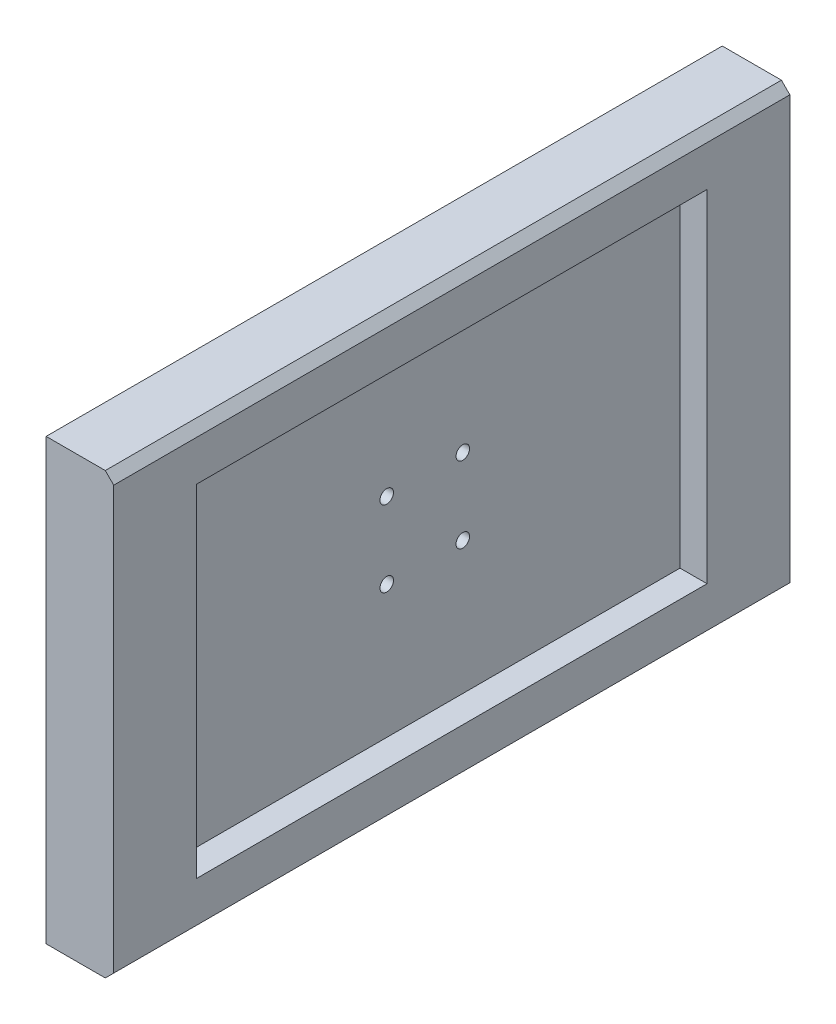
ISO-10303-21;
HEADER;
FILE_DESCRIPTION(('STEP AP214'),'2;1');
FILE_NAME('part.step','',(''),(''),'','','');
FILE_SCHEMA(('AUTOMOTIVE_DESIGN { 1 0 10303 214 1 1 1 1 }'));
ENDSEC;
DATA;
#1=APPLICATION_CONTEXT('core data for automotive mechanical design processes');
#2=APPLICATION_PROTOCOL_DEFINITION('international standard','automotive_design',2000,#1);
#3=PRODUCT_CONTEXT('',#1,'mechanical');
#4=PRODUCT('Part','Part','',(#3));
#5=PRODUCT_RELATED_PRODUCT_CATEGORY('part','',(#4));
#6=PRODUCT_DEFINITION_FORMATION('','',#4);
#7=PRODUCT_DEFINITION_CONTEXT('part definition',#1,'design');
#8=PRODUCT_DEFINITION('design','',#6,#7);
#9=PRODUCT_DEFINITION_SHAPE('','',#8);
#10=(LENGTH_UNIT() NAMED_UNIT(*) SI_UNIT(.MILLI.,.METRE.));
#11=(NAMED_UNIT(*) PLANE_ANGLE_UNIT() SI_UNIT($,.RADIAN.));
#12=(NAMED_UNIT(*) SI_UNIT($,.STERADIAN.) SOLID_ANGLE_UNIT());
#13=UNCERTAINTY_MEASURE_WITH_UNIT(LENGTH_MEASURE(1.E-05),#10,'distance_accuracy_value','');
#14=(GEOMETRIC_REPRESENTATION_CONTEXT(3) GLOBAL_UNCERTAINTY_ASSIGNED_CONTEXT((#13)) GLOBAL_UNIT_ASSIGNED_CONTEXT((#10,
#11,#12)) REPRESENTATION_CONTEXT('',''));
#15=CARTESIAN_POINT('',(0.,0.,0.));
#16=DIRECTION('',(0.,0.,1.));
#17=DIRECTION('',(1.,0.,0.));
#18=AXIS2_PLACEMENT_3D('',#15,#16,#17);
#19=CARTESIAN_POINT('',(41.5,-26.,40.));
#20=DIRECTION('',(0.,0.,-1.));
#21=DIRECTION('',(-1.,0.,0.));
#22=AXIS2_PLACEMENT_3D('',#19,#20,#21);
#23=PLANE('',#22);
#24=DIRECTION('',(-1.,0.,0.));
#25=VECTOR('',#24,1.);
#26=CARTESIAN_POINT('',(41.5,-26.,40.));
#27=LINE('',#26,#25);
#28=CARTESIAN_POINT('',(40.5,-26.,40.));
#29=VERTEX_POINT('',#28);
#30=CARTESIAN_POINT('',(33.5,-26.,40.));
#31=VERTEX_POINT('',#30);
#32=EDGE_CURVE('E236',#29,#31,#27,.T.);
#33=ORIENTED_EDGE('',*,*,#32,.F.);
#34=DIRECTION('',(-0.707106781186548,-0.707106781186548,0.));
#35=VECTOR('',#34,1.);
#36=CARTESIAN_POINT('',(41.5,-25.,40.));
#37=LINE('',#36,#35);
#38=CARTESIAN_POINT('',(41.5,-25.,40.));
#39=VERTEX_POINT('',#38);
#40=EDGE_CURVE('E51',#29,#39,#37,.F.);
#41=ORIENTED_EDGE('',*,*,#40,.T.);
#42=DIRECTION('',(0.,-1.,0.));
#43=VECTOR('',#42,1.);
#44=CARTESIAN_POINT('',(41.5,-26.,40.));
#45=LINE('',#44,#43);
#46=CARTESIAN_POINT('',(41.5,25.,40.));
#47=VERTEX_POINT('',#46);
#48=EDGE_CURVE('E204',#47,#39,#45,.T.);
#49=ORIENTED_EDGE('',*,*,#48,.F.);
#50=DIRECTION('',(0.707106781186548,-0.707106781186548,0.));
#51=VECTOR('',#50,1.);
#52=CARTESIAN_POINT('',(41.5,25.,40.));
#53=LINE('',#52,#51);
#54=CARTESIAN_POINT('',(40.5,26.,40.));
#55=VERTEX_POINT('',#54);
#56=EDGE_CURVE('E58',#47,#55,#53,.F.);
#57=ORIENTED_EDGE('',*,*,#56,.T.);
#58=DIRECTION('',(-1.,0.,0.));
#59=VECTOR('',#58,1.);
#60=CARTESIAN_POINT('',(41.5,26.,40.));
#61=LINE('',#60,#59);
#62=CARTESIAN_POINT('',(33.5,26.,40.));
#63=VERTEX_POINT('',#62);
#64=EDGE_CURVE('E213',#55,#63,#61,.T.);
#65=ORIENTED_EDGE('',*,*,#64,.T.);
#66=DIRECTION('',(0.,-1.,0.));
#67=VECTOR('',#66,1.);
#68=CARTESIAN_POINT('',(33.5,-26.,40.));
#69=LINE('',#68,#67);
#70=EDGE_CURVE('E203',#63,#31,#69,.T.);
#71=ORIENTED_EDGE('',*,*,#70,.T.);
#72=EDGE_LOOP('',(#33,#41,#49,#57,#65,#71));
#73=FACE_BOUND('',#72,.T.);
#74=ADVANCED_FACE('F41',(#73),#23,.F.);
#75=CARTESIAN_POINT('',(41.5,-26.,40.));
#76=DIRECTION('',(0.,1.,0.));
#77=DIRECTION('',(0.,0.,1.));
#78=AXIS2_PLACEMENT_3D('',#75,#76,#77);
#79=PLANE('',#78);
#80=DIRECTION('',(-1.,0.,0.));
#81=VECTOR('',#80,1.);
#82=CARTESIAN_POINT('',(41.5,-26.,-40.));
#83=LINE('',#82,#81);
#84=CARTESIAN_POINT('',(40.5,-26.,-40.));
#85=VERTEX_POINT('',#84);
#86=CARTESIAN_POINT('',(33.5,-26.,-40.));
#87=VERTEX_POINT('',#86);
#88=EDGE_CURVE('E233',#85,#87,#83,.T.);
#89=ORIENTED_EDGE('',*,*,#88,.F.);
#90=DIRECTION('',(0.,0.,1.));
#91=VECTOR('',#90,1.);
#92=CARTESIAN_POINT('',(40.5,-26.,40.));
#93=LINE('',#92,#91);
#94=EDGE_CURVE('E66',#85,#29,#93,.T.);
#95=ORIENTED_EDGE('',*,*,#94,.T.);
#96=ORIENTED_EDGE('',*,*,#32,.T.);
#97=DIRECTION('',(0.,0.,-1.));
#98=VECTOR('',#97,1.);
#99=CARTESIAN_POINT('',(33.5,-26.,40.));
#100=LINE('',#99,#98);
#101=EDGE_CURVE('E217',#31,#87,#100,.T.);
#102=ORIENTED_EDGE('',*,*,#101,.T.);
#103=EDGE_LOOP('',(#89,#95,#96,#102));
#104=FACE_BOUND('',#103,.T.);
#105=ADVANCED_FACE('F270',(#104),#79,.F.);
#106=CARTESIAN_POINT('',(41.5,-26.,-40.));
#107=DIRECTION('',(0.,0.,1.));
#108=DIRECTION('',(1.,0.,0.));
#109=AXIS2_PLACEMENT_3D('',#106,#107,#108);
#110=PLANE('',#109);
#111=DIRECTION('',(0.,1.,0.));
#112=VECTOR('',#111,1.);
#113=CARTESIAN_POINT('',(41.5,-26.,-40.));
#114=LINE('',#113,#112);
#115=CARTESIAN_POINT('',(41.5,-25.,-40.));
#116=VERTEX_POINT('',#115);
#117=CARTESIAN_POINT('',(41.5,25.,-40.));
#118=VERTEX_POINT('',#117);
#119=EDGE_CURVE('E208',#116,#118,#114,.T.);
#120=ORIENTED_EDGE('',*,*,#119,.F.);
#121=DIRECTION('',(0.707106781186548,0.707106781186548,0.));
#122=VECTOR('',#121,1.);
#123=CARTESIAN_POINT('',(41.5,-25.,-40.));
#124=LINE('',#123,#122);
#125=EDGE_CURVE('E253',#116,#85,#124,.F.);
#126=ORIENTED_EDGE('',*,*,#125,.T.);
#127=ORIENTED_EDGE('',*,*,#88,.T.);
#128=DIRECTION('',(0.,1.,0.));
#129=VECTOR('',#128,1.);
#130=CARTESIAN_POINT('',(33.5,-26.,-40.));
#131=LINE('',#130,#129);
#132=CARTESIAN_POINT('',(33.5,26.,-40.));
#133=VERTEX_POINT('',#132);
#134=EDGE_CURVE('E221',#87,#133,#131,.T.);
#135=ORIENTED_EDGE('',*,*,#134,.T.);
#136=DIRECTION('',(-1.,0.,0.));
#137=VECTOR('',#136,1.);
#138=CARTESIAN_POINT('',(41.5,26.,-40.));
#139=LINE('',#138,#137);
#140=CARTESIAN_POINT('',(40.5,26.,-40.));
#141=VERTEX_POINT('',#140);
#142=EDGE_CURVE('E230',#141,#133,#139,.T.);
#143=ORIENTED_EDGE('',*,*,#142,.F.);
#144=DIRECTION('',(-0.707106781186548,0.707106781186548,0.));
#145=VECTOR('',#144,1.);
#146=CARTESIAN_POINT('',(41.5,25.,-40.));
#147=LINE('',#146,#145);
#148=EDGE_CURVE('E250',#141,#118,#147,.F.);
#149=ORIENTED_EDGE('',*,*,#148,.T.);
#150=EDGE_LOOP('',(#120,#126,#127,#135,#143,#149));
#151=FACE_BOUND('',#150,.T.);
#152=ADVANCED_FACE('F269',(#151),#110,.F.);
#153=CARTESIAN_POINT('',(41.5,26.,40.));
#154=DIRECTION('',(0.,-1.,0.));
#155=DIRECTION('',(0.,0.,-1.));
#156=AXIS2_PLACEMENT_3D('',#153,#154,#155);
#157=PLANE('',#156);
#158=ORIENTED_EDGE('',*,*,#64,.F.);
#159=DIRECTION('',(0.,0.,-1.));
#160=VECTOR('',#159,1.);
#161=CARTESIAN_POINT('',(40.5,26.,40.));
#162=LINE('',#161,#160);
#163=EDGE_CURVE('E11',#55,#141,#162,.T.);
#164=ORIENTED_EDGE('',*,*,#163,.T.);
#165=ORIENTED_EDGE('',*,*,#142,.T.);
#166=DIRECTION('',(0.,0.,1.));
#167=VECTOR('',#166,1.);
#168=CARTESIAN_POINT('',(33.5,26.,40.));
#169=LINE('',#168,#167);
#170=EDGE_CURVE('E209',#133,#63,#169,.T.);
#171=ORIENTED_EDGE('',*,*,#170,.T.);
#172=EDGE_LOOP('',(#158,#164,#165,#171));
#173=FACE_BOUND('',#172,.T.);
#174=ADVANCED_FACE('F282',(#173),#157,.F.);
#175=CARTESIAN_POINT('',(41.5,0.,0.));
#176=DIRECTION('',(-1.,0.,0.));
#177=DIRECTION('',(0.,0.,1.));
#178=AXIS2_PLACEMENT_3D('',#175,#176,#177);
#179=PLANE('',#178);
#180=DIRECTION('',(0.,0.,-1.));
#181=VECTOR('',#180,1.);
#182=CARTESIAN_POINT('',(41.5,-20.2,30.2));
#183=LINE('',#182,#181);
#184=CARTESIAN_POINT('',(41.5,-20.2,30.2));
#185=VERTEX_POINT('',#184);
#186=CARTESIAN_POINT('',(41.5,-20.2,-30.2));
#187=VERTEX_POINT('',#186);
#188=EDGE_CURVE('E160',#185,#187,#183,.T.);
#189=ORIENTED_EDGE('',*,*,#188,.F.);
#190=DIRECTION('',(0.,-1.,0.));
#191=VECTOR('',#190,1.);
#192=CARTESIAN_POINT('',(41.5,-20.2,30.2));
#193=LINE('',#192,#191);
#194=CARTESIAN_POINT('',(41.5,20.2,30.2));
#195=VERTEX_POINT('',#194);
#196=EDGE_CURVE('E127',#195,#185,#193,.T.);
#197=ORIENTED_EDGE('',*,*,#196,.F.);
#198=DIRECTION('',(0.,0.,1.));
#199=VECTOR('',#198,1.);
#200=CARTESIAN_POINT('',(41.5,20.2,30.2));
#201=LINE('',#200,#199);
#202=CARTESIAN_POINT('',(41.5,20.2,-30.2));
#203=VERTEX_POINT('',#202);
#204=EDGE_CURVE('E147',#203,#195,#201,.T.);
#205=ORIENTED_EDGE('',*,*,#204,.F.);
#206=DIRECTION('',(0.,1.,0.));
#207=VECTOR('',#206,1.);
#208=CARTESIAN_POINT('',(41.5,-20.2,-30.2));
#209=LINE('',#208,#207);
#210=EDGE_CURVE('E151',#187,#203,#209,.T.);
#211=ORIENTED_EDGE('',*,*,#210,.F.);
#212=EDGE_LOOP('',(#189,#197,#205,#211));
#213=FACE_BOUND('',#212,.T.);
#214=ORIENTED_EDGE('',*,*,#48,.T.);
#215=DIRECTION('',(0.,0.,-1.));
#216=VECTOR('',#215,1.);
#217=CARTESIAN_POINT('',(41.5,-25.,0.));
#218=LINE('',#217,#216);
#219=EDGE_CURVE('E246',#39,#116,#218,.T.);
#220=ORIENTED_EDGE('',*,*,#219,.T.);
#221=ORIENTED_EDGE('',*,*,#119,.T.);
#222=DIRECTION('',(0.,0.,1.));
#223=VECTOR('',#222,1.);
#224=CARTESIAN_POINT('',(41.5,25.,0.));
#225=LINE('',#224,#223);
#226=EDGE_CURVE('E239',#118,#47,#225,.T.);
#227=ORIENTED_EDGE('',*,*,#226,.T.);
#228=EDGE_LOOP('',(#214,#220,#221,#227));
#229=FACE_BOUND('',#228,.T.);
#230=ADVANCED_FACE('F264',(#213,#229),#179,.F.);
#231=CARTESIAN_POINT('',(33.5,0.,0.));
#232=DIRECTION('',(-1.,0.,0.));
#233=DIRECTION('',(0.,0.,1.));
#234=AXIS2_PLACEMENT_3D('',#231,#232,#233);
#235=PLANE('',#234);
#236=CARTESIAN_POINT('',(33.5,-4.5,-4.5));
#237=DIRECTION('',(1.,0.,0.));
#238=DIRECTION('',(0.,0.,-1.));
#239=AXIS2_PLACEMENT_3D('',#236,#237,#238);
#240=CIRCLE('',#239,0.8);
#241=CARTESIAN_POINT('',(33.5,-4.5,-5.3));
#242=VERTEX_POINT('',#241);
#243=EDGE_CURVE('E192',#242,#242,#240,.T.);
#244=ORIENTED_EDGE('',*,*,#243,.T.);
#245=EDGE_LOOP('',(#244));
#246=FACE_BOUND('',#245,.T.);
#247=CARTESIAN_POINT('',(33.5,4.5,4.5));
#248=DIRECTION('',(1.,0.,0.));
#249=DIRECTION('',(0.,0.,-1.));
#250=AXIS2_PLACEMENT_3D('',#247,#248,#249);
#251=CIRCLE('',#250,0.8);
#252=CARTESIAN_POINT('',(33.5,4.5,3.7));
#253=VERTEX_POINT('',#252);
#254=EDGE_CURVE('E191',#253,#253,#251,.T.);
#255=ORIENTED_EDGE('',*,*,#254,.T.);
#256=EDGE_LOOP('',(#255));
#257=FACE_BOUND('',#256,.T.);
#258=CARTESIAN_POINT('',(33.5,4.5,-4.5));
#259=DIRECTION('',(1.,0.,0.));
#260=DIRECTION('',(0.,0.,-1.));
#261=AXIS2_PLACEMENT_3D('',#258,#259,#260);
#262=CIRCLE('',#261,0.8);
#263=CARTESIAN_POINT('',(33.5,4.5,-5.3));
#264=VERTEX_POINT('',#263);
#265=EDGE_CURVE('E187',#264,#264,#262,.T.);
#266=ORIENTED_EDGE('',*,*,#265,.T.);
#267=EDGE_LOOP('',(#266));
#268=FACE_BOUND('',#267,.T.);
#269=CARTESIAN_POINT('',(33.5,-4.5,4.5));
#270=DIRECTION('',(1.,0.,0.));
#271=DIRECTION('',(0.,0.,-1.));
#272=AXIS2_PLACEMENT_3D('',#269,#270,#271);
#273=CIRCLE('',#272,0.8);
#274=CARTESIAN_POINT('',(33.5,-4.5,3.7));
#275=VERTEX_POINT('',#274);
#276=EDGE_CURVE('E196',#275,#275,#273,.T.);
#277=ORIENTED_EDGE('',*,*,#276,.T.);
#278=EDGE_LOOP('',(#277));
#279=FACE_BOUND('',#278,.T.);
#280=ORIENTED_EDGE('',*,*,#70,.F.);
#281=ORIENTED_EDGE('',*,*,#170,.F.);
#282=ORIENTED_EDGE('',*,*,#134,.F.);
#283=ORIENTED_EDGE('',*,*,#101,.F.);
#284=EDGE_LOOP('',(#280,#281,#282,#283));
#285=FACE_BOUND('',#284,.T.);
#286=ADVANCED_FACE('F276',(#246,#257,#268,#279,#285),#235,.T.);
#287=CARTESIAN_POINT('',(38.5,-4.5,4.5));
#288=DIRECTION('',(-1.,0.,0.));
#289=DIRECTION('',(0.,0.,1.));
#290=AXIS2_PLACEMENT_3D('',#287,#288,#289);
#291=CYLINDRICAL_SURFACE('',#290,0.8);
#292=CARTESIAN_POINT('',(38.3,-4.5,4.5));
#293=DIRECTION('',(-1.,0.,0.));
#294=DIRECTION('',(0.,0.,1.));
#295=AXIS2_PLACEMENT_3D('',#292,#293,#294);
#296=CIRCLE('',#295,0.8);
#297=CARTESIAN_POINT('',(38.3,-4.5,5.3));
#298=VERTEX_POINT('',#297);
#299=EDGE_CURVE('E183',#298,#298,#296,.T.);
#300=ORIENTED_EDGE('',*,*,#299,.F.);
#301=EDGE_LOOP('',(#300));
#302=FACE_BOUND('',#301,.T.);
#303=ORIENTED_EDGE('',*,*,#276,.F.);
#304=EDGE_LOOP('',(#303));
#305=FACE_BOUND('',#304,.T.);
#306=ADVANCED_FACE('F330',(#302,#305),#291,.F.);
#307=CARTESIAN_POINT('',(38.5,4.5,-4.5));
#308=DIRECTION('',(-1.,0.,0.));
#309=DIRECTION('',(0.,0.,1.));
#310=AXIS2_PLACEMENT_3D('',#307,#308,#309);
#311=CYLINDRICAL_SURFACE('',#310,0.8);
#312=CARTESIAN_POINT('',(38.3,4.5,-4.5));
#313=DIRECTION('',(-1.,0.,0.));
#314=DIRECTION('',(0.,0.,1.));
#315=AXIS2_PLACEMENT_3D('',#312,#313,#314);
#316=CIRCLE('',#315,0.8);
#317=CARTESIAN_POINT('',(38.3,4.5,-3.7));
#318=VERTEX_POINT('',#317);
#319=EDGE_CURVE('E179',#318,#318,#316,.T.);
#320=ORIENTED_EDGE('',*,*,#319,.F.);
#321=EDGE_LOOP('',(#320));
#322=FACE_BOUND('',#321,.T.);
#323=ORIENTED_EDGE('',*,*,#265,.F.);
#324=EDGE_LOOP('',(#323));
#325=FACE_BOUND('',#324,.T.);
#326=ADVANCED_FACE('F326',(#322,#325),#311,.F.);
#327=CARTESIAN_POINT('',(38.5,4.5,4.5));
#328=DIRECTION('',(-1.,0.,0.));
#329=DIRECTION('',(0.,0.,1.));
#330=AXIS2_PLACEMENT_3D('',#327,#328,#329);
#331=CYLINDRICAL_SURFACE('',#330,0.8);
#332=CARTESIAN_POINT('',(38.3,4.5,4.5));
#333=DIRECTION('',(-1.,0.,0.));
#334=DIRECTION('',(0.,0.,1.));
#335=AXIS2_PLACEMENT_3D('',#332,#333,#334);
#336=CIRCLE('',#335,0.8);
#337=CARTESIAN_POINT('',(38.3,4.5,5.3));
#338=VERTEX_POINT('',#337);
#339=EDGE_CURVE('E175',#338,#338,#336,.T.);
#340=ORIENTED_EDGE('',*,*,#339,.F.);
#341=EDGE_LOOP('',(#340));
#342=FACE_BOUND('',#341,.T.);
#343=ORIENTED_EDGE('',*,*,#254,.F.);
#344=EDGE_LOOP('',(#343));
#345=FACE_BOUND('',#344,.T.);
#346=ADVANCED_FACE('F329',(#342,#345),#331,.F.);
#347=CARTESIAN_POINT('',(38.5,-4.5,-4.5));
#348=DIRECTION('',(-1.,0.,0.));
#349=DIRECTION('',(0.,0.,1.));
#350=AXIS2_PLACEMENT_3D('',#347,#348,#349);
#351=CYLINDRICAL_SURFACE('',#350,0.8);
#352=CARTESIAN_POINT('',(38.3,-4.5,-4.5));
#353=DIRECTION('',(-1.,0.,0.));
#354=DIRECTION('',(0.,0.,1.));
#355=AXIS2_PLACEMENT_3D('',#352,#353,#354);
#356=CIRCLE('',#355,0.8);
#357=CARTESIAN_POINT('',(38.3,-4.5,-3.7));
#358=VERTEX_POINT('',#357);
#359=EDGE_CURVE('E169',#358,#358,#356,.T.);
#360=ORIENTED_EDGE('',*,*,#359,.F.);
#361=EDGE_LOOP('',(#360));
#362=FACE_BOUND('',#361,.T.);
#363=ORIENTED_EDGE('',*,*,#243,.F.);
#364=EDGE_LOOP('',(#363));
#365=FACE_BOUND('',#364,.T.);
#366=ADVANCED_FACE('F325',(#362,#365),#351,.F.);
#367=CARTESIAN_POINT('',(38.3,-20.2,30.2));
#368=DIRECTION('',(0.,0.,1.));
#369=DIRECTION('',(1.,0.,0.));
#370=AXIS2_PLACEMENT_3D('',#367,#368,#369);
#371=PLANE('',#370);
#372=ORIENTED_EDGE('',*,*,#196,.T.);
#373=DIRECTION('',(1.,0.,0.));
#374=VECTOR('',#373,1.);
#375=CARTESIAN_POINT('',(38.3,-20.2,30.2));
#376=LINE('',#375,#374);
#377=CARTESIAN_POINT('',(38.3,-20.2,30.2));
#378=VERTEX_POINT('',#377);
#379=EDGE_CURVE('E120',#378,#185,#376,.T.);
#380=ORIENTED_EDGE('',*,*,#379,.F.);
#381=DIRECTION('',(0.,-1.,0.));
#382=VECTOR('',#381,1.);
#383=CARTESIAN_POINT('',(38.3,-20.2,30.2));
#384=LINE('',#383,#382);
#385=CARTESIAN_POINT('',(38.3,20.2,30.2));
#386=VERTEX_POINT('',#385);
#387=EDGE_CURVE('E124',#386,#378,#384,.T.);
#388=ORIENTED_EDGE('',*,*,#387,.F.);
#389=DIRECTION('',(1.,0.,0.));
#390=VECTOR('',#389,1.);
#391=CARTESIAN_POINT('',(38.3,20.2,30.2));
#392=LINE('',#391,#390);
#393=EDGE_CURVE('E166',#386,#195,#392,.T.);
#394=ORIENTED_EDGE('',*,*,#393,.T.);
#395=EDGE_LOOP('',(#372,#380,#388,#394));
#396=FACE_BOUND('',#395,.T.);
#397=ADVANCED_FACE('F122',(#396),#371,.F.);
#398=CARTESIAN_POINT('',(38.3,20.2,30.2));
#399=DIRECTION('',(0.,1.,0.));
#400=DIRECTION('',(0.,0.,1.));
#401=AXIS2_PLACEMENT_3D('',#398,#399,#400);
#402=PLANE('',#401);
#403=ORIENTED_EDGE('',*,*,#204,.T.);
#404=ORIENTED_EDGE('',*,*,#393,.F.);
#405=DIRECTION('',(0.,0.,1.));
#406=VECTOR('',#405,1.);
#407=CARTESIAN_POINT('',(38.3,20.2,30.2));
#408=LINE('',#407,#406);
#409=CARTESIAN_POINT('',(38.3,20.2,-30.2));
#410=VERTEX_POINT('',#409);
#411=EDGE_CURVE('E133',#410,#386,#408,.T.);
#412=ORIENTED_EDGE('',*,*,#411,.F.);
#413=DIRECTION('',(1.,0.,0.));
#414=VECTOR('',#413,1.);
#415=CARTESIAN_POINT('',(38.3,20.2,-30.2));
#416=LINE('',#415,#414);
#417=EDGE_CURVE('E170',#410,#203,#416,.T.);
#418=ORIENTED_EDGE('',*,*,#417,.T.);
#419=EDGE_LOOP('',(#403,#404,#412,#418));
#420=FACE_BOUND('',#419,.T.);
#421=ADVANCED_FACE('F316',(#420),#402,.F.);
#422=CARTESIAN_POINT('',(38.3,-20.2,-30.2));
#423=DIRECTION('',(0.,0.,-1.));
#424=DIRECTION('',(-1.,0.,0.));
#425=AXIS2_PLACEMENT_3D('',#422,#423,#424);
#426=PLANE('',#425);
#427=ORIENTED_EDGE('',*,*,#210,.T.);
#428=ORIENTED_EDGE('',*,*,#417,.F.);
#429=DIRECTION('',(0.,1.,0.));
#430=VECTOR('',#429,1.);
#431=CARTESIAN_POINT('',(38.3,-20.2,-30.2));
#432=LINE('',#431,#430);
#433=CARTESIAN_POINT('',(38.3,-20.2,-30.2));
#434=VERTEX_POINT('',#433);
#435=EDGE_CURVE('E142',#434,#410,#432,.T.);
#436=ORIENTED_EDGE('',*,*,#435,.F.);
#437=DIRECTION('',(1.,0.,0.));
#438=VECTOR('',#437,1.);
#439=CARTESIAN_POINT('',(38.3,-20.2,-30.2));
#440=LINE('',#439,#438);
#441=EDGE_CURVE('E132',#434,#187,#440,.T.);
#442=ORIENTED_EDGE('',*,*,#441,.T.);
#443=EDGE_LOOP('',(#427,#428,#436,#442));
#444=FACE_BOUND('',#443,.T.);
#445=ADVANCED_FACE('F312',(#444),#426,.F.);
#446=CARTESIAN_POINT('',(38.3,-20.2,30.2));
#447=DIRECTION('',(0.,-1.,0.));
#448=DIRECTION('',(0.,0.,-1.));
#449=AXIS2_PLACEMENT_3D('',#446,#447,#448);
#450=PLANE('',#449);
#451=ORIENTED_EDGE('',*,*,#188,.T.);
#452=ORIENTED_EDGE('',*,*,#441,.F.);
#453=DIRECTION('',(0.,0.,-1.));
#454=VECTOR('',#453,1.);
#455=CARTESIAN_POINT('',(38.3,-20.2,30.2));
#456=LINE('',#455,#454);
#457=EDGE_CURVE('E136',#378,#434,#456,.T.);
#458=ORIENTED_EDGE('',*,*,#457,.F.);
#459=ORIENTED_EDGE('',*,*,#379,.T.);
#460=EDGE_LOOP('',(#451,#452,#458,#459));
#461=FACE_BOUND('',#460,.T.);
#462=ADVANCED_FACE('F137',(#461),#450,.F.);
#463=CARTESIAN_POINT('',(38.3,0.,0.));
#464=DIRECTION('',(-1.,0.,0.));
#465=DIRECTION('',(0.,0.,1.));
#466=AXIS2_PLACEMENT_3D('',#463,#464,#465);
#467=PLANE('',#466);
#468=ORIENTED_EDGE('',*,*,#299,.T.);
#469=EDGE_LOOP('',(#468));
#470=FACE_BOUND('',#469,.T.);
#471=ORIENTED_EDGE('',*,*,#319,.T.);
#472=EDGE_LOOP('',(#471));
#473=FACE_BOUND('',#472,.T.);
#474=ORIENTED_EDGE('',*,*,#339,.T.);
#475=EDGE_LOOP('',(#474));
#476=FACE_BOUND('',#475,.T.);
#477=ORIENTED_EDGE('',*,*,#359,.T.);
#478=EDGE_LOOP('',(#477));
#479=FACE_BOUND('',#478,.T.);
#480=ORIENTED_EDGE('',*,*,#387,.T.);
#481=ORIENTED_EDGE('',*,*,#457,.T.);
#482=ORIENTED_EDGE('',*,*,#435,.T.);
#483=ORIENTED_EDGE('',*,*,#411,.T.);
#484=EDGE_LOOP('',(#480,#481,#482,#483));
#485=FACE_BOUND('',#484,.T.);
#486=ADVANCED_FACE('F144',(#470,#473,#476,#479,#485),#467,.F.);
#487=CARTESIAN_POINT('',(41.5,-25.,0.));
#488=DIRECTION('',(-0.707106781186547,0.707106781186547,0.));
#489=DIRECTION('',(0.,0.,-1.));
#490=AXIS2_PLACEMENT_3D('',#487,#488,#489);
#491=PLANE('',#490);
#492=ORIENTED_EDGE('',*,*,#40,.F.);
#493=ORIENTED_EDGE('',*,*,#94,.F.);
#494=ORIENTED_EDGE('',*,*,#125,.F.);
#495=ORIENTED_EDGE('',*,*,#219,.F.);
#496=EDGE_LOOP('',(#492,#493,#494,#495));
#497=FACE_BOUND('',#496,.T.);
#498=ADVANCED_FACE('F267',(#497),#491,.F.);
#499=CARTESIAN_POINT('',(41.5,25.,0.));
#500=DIRECTION('',(-0.707106781186547,-0.707106781186547,0.));
#501=DIRECTION('',(0.,0.,1.));
#502=AXIS2_PLACEMENT_3D('',#499,#500,#501);
#503=PLANE('',#502);
#504=ORIENTED_EDGE('',*,*,#148,.F.);
#505=ORIENTED_EDGE('',*,*,#163,.F.);
#506=ORIENTED_EDGE('',*,*,#56,.F.);
#507=ORIENTED_EDGE('',*,*,#226,.F.);
#508=EDGE_LOOP('',(#504,#505,#506,#507));
#509=FACE_BOUND('',#508,.T.);
#510=ADVANCED_FACE('F44',(#509),#503,.F.);
#511=CLOSED_SHELL('',(#74,#105,#152,#174,#230,#286,#306,#326,#346,#366,#397,#421,#445,#462,#486,
#498,#510));
#512=MANIFOLD_SOLID_BREP('B2',#511);
#513=ADVANCED_BREP_SHAPE_REPRESENTATION('',(#18,#512),#14);
#514=SHAPE_DEFINITION_REPRESENTATION(#9,#513);
ENDSEC;
END-ISO-10303-21;
